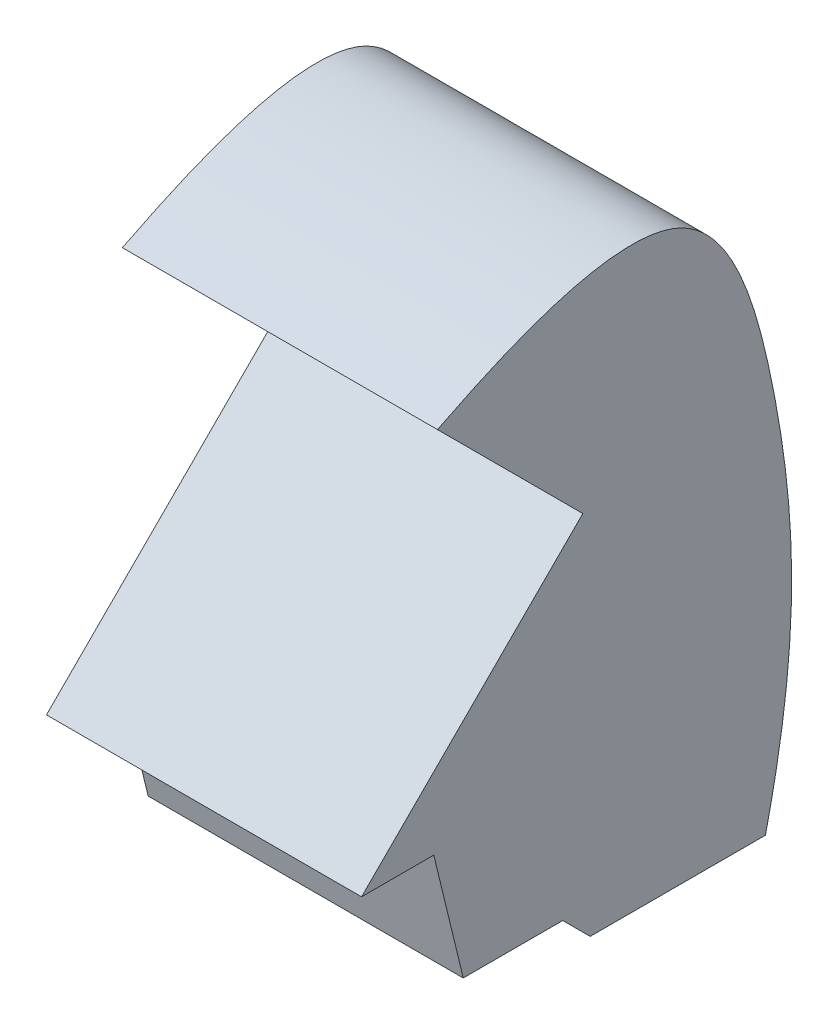
ISO-10303-21;
HEADER;
FILE_DESCRIPTION(('STEP AP214'),'2;1');
FILE_NAME('part.step','',(''),(''),'','','');
FILE_SCHEMA(('AUTOMOTIVE_DESIGN { 1 0 10303 214 1 1 1 1 }'));
ENDSEC;
DATA;
#1=APPLICATION_CONTEXT('core data for automotive mechanical design processes');
#2=APPLICATION_PROTOCOL_DEFINITION('international standard','automotive_design',2000,#1);
#3=PRODUCT_CONTEXT('',#1,'mechanical');
#4=PRODUCT('Part','Part','',(#3));
#5=PRODUCT_RELATED_PRODUCT_CATEGORY('part','',(#4));
#6=PRODUCT_DEFINITION_FORMATION('','',#4);
#7=PRODUCT_DEFINITION_CONTEXT('part definition',#1,'design');
#8=PRODUCT_DEFINITION('design','',#6,#7);
#9=PRODUCT_DEFINITION_SHAPE('','',#8);
#10=(LENGTH_UNIT() NAMED_UNIT(*) SI_UNIT(.MILLI.,.METRE.));
#11=(NAMED_UNIT(*) PLANE_ANGLE_UNIT() SI_UNIT($,.RADIAN.));
#12=(NAMED_UNIT(*) SI_UNIT($,.STERADIAN.) SOLID_ANGLE_UNIT());
#13=UNCERTAINTY_MEASURE_WITH_UNIT(LENGTH_MEASURE(1.E-05),#10,'distance_accuracy_value','');
#14=(GEOMETRIC_REPRESENTATION_CONTEXT(3) GLOBAL_UNCERTAINTY_ASSIGNED_CONTEXT((#13)) GLOBAL_UNIT_ASSIGNED_CONTEXT((#10,
#11,#12)) REPRESENTATION_CONTEXT('',''));
#15=CARTESIAN_POINT('',(0.,0.,0.));
#16=DIRECTION('',(0.,0.,1.));
#17=DIRECTION('',(1.,0.,0.));
#18=AXIS2_PLACEMENT_3D('',#15,#16,#17);
#19=CARTESIAN_POINT('',(-240.,371.568532593606,329.847711511774));
#20=DIRECTION('',(0.,-0.707106781186554,0.707106781186541));
#21=DIRECTION('',(0.,-0.707106781186541,-0.707106781186554));
#22=AXIS2_PLACEMENT_3D('',#19,#20,#21);
#23=PLANE('',#22);
#24=DIRECTION('',(0.,-0.707106781186541,-0.707106781186554));
#25=VECTOR('',#24,1.);
#26=CARTESIAN_POINT('',(0.,371.568532593606,329.847711511774));
#27=LINE('',#26,#25);
#28=CARTESIAN_POINT('',(0.,371.568532593606,329.847711511774));
#29=VERTEX_POINT('',#28);
#30=CARTESIAN_POINT('',(0.,260.825709510995,219.10488842916));
#31=VERTEX_POINT('',#30);
#32=EDGE_CURVE('E162',#29,#31,#27,.T.);
#33=ORIENTED_EDGE('',*,*,#32,.F.);
#34=DIRECTION('',(1.,0.,0.));
#35=VECTOR('',#34,1.);
#36=CARTESIAN_POINT('',(-240.,371.568532593606,329.847711511774));
#37=LINE('',#36,#35);
#38=CARTESIAN_POINT('',(-240.,371.568532593606,329.847711511774));
#39=VERTEX_POINT('',#38);
#40=EDGE_CURVE('E70',#39,#29,#37,.T.);
#41=ORIENTED_EDGE('',*,*,#40,.F.);
#42=DIRECTION('',(0.,-0.707106781186541,-0.707106781186554));
#43=VECTOR('',#42,1.);
#44=CARTESIAN_POINT('',(-240.,371.568532593606,329.847711511774));
#45=LINE('',#44,#43);
#46=CARTESIAN_POINT('',(-240.,260.825709510995,219.10488842916));
#47=VERTEX_POINT('',#46);
#48=EDGE_CURVE('E225',#39,#47,#45,.T.);
#49=ORIENTED_EDGE('',*,*,#48,.T.);
#50=DIRECTION('',(1.,0.,0.));
#51=VECTOR('',#50,1.);
#52=CARTESIAN_POINT('',(-240.,260.825709510995,219.10488842916));
#53=LINE('',#52,#51);
#54=EDGE_CURVE('E109',#47,#31,#53,.T.);
#55=ORIENTED_EDGE('',*,*,#54,.T.);
#56=EDGE_LOOP('',(#33,#41,#49,#55));
#57=FACE_BOUND('',#56,.T.);
#58=ADVANCED_FACE('F42',(#57),#23,.T.);
#59=CARTESIAN_POINT('',(-240.,371.568532593606,329.847711511774));
#60=CARTESIAN_POINT('',(-240.,393.514529027131,285.97406079657));
#61=CARTESIAN_POINT('',(-240.,470.611046021341,126.542642418236));
#62=CARTESIAN_POINT('',(-240.,211.203281294099,51.9180186353815));
#63=CARTESIAN_POINT('',(-240.,83.9872274148738,55.6395822393396));
#64=CARTESIAN_POINT('',(-240.,-20.9110778897071,80.0216255201108));
#65=B_SPLINE_CURVE_WITH_KNOTS('',3,(#59,#60,#61,#62,#63,#64),.UNSPECIFIED.,.F.,.F.,(4,1,1,4),
(0.,0.297117955120671,0.535651130390916,1.),.UNSPECIFIED.);
#66=DIRECTION('',(1.,0.,0.));
#67=VECTOR('',#66,1.);
#68=SURFACE_OF_LINEAR_EXTRUSION('',#65,#67);
#69=CARTESIAN_POINT('',(-107.552830020397,153.954227250641,60.3388246388247));
#70=CARTESIAN_POINT('',(-107.039405009663,154.049745430526,60.3414869693893));
#71=CARTESIAN_POINT('',(-106.527129661787,154.15132036925,60.3443411947038));
#72=CARTESIAN_POINT('',(-105.504966032531,154.365684513344,60.3504260574453));
#73=CARTESIAN_POINT('',(-104.995077591406,154.47847295668,60.3536566692968));
#74=CARTESIAN_POINT('',(-103.977535633197,154.71441752506,60.3604884335589));
#75=CARTESIAN_POINT('',(-103.469882920643,154.837577105064,60.364089709539));
#76=CARTESIAN_POINT('',(-102.457028041932,155.093612441107,60.3716624328432));
#77=CARTESIAN_POINT('',(-101.951825927409,155.22648840093,60.3756338879315));
#78=CARTESIAN_POINT('',(-100.943742649153,155.50154294139,60.3839536350332));
#79=CARTESIAN_POINT('',(-100.440862517759,155.64372529973,60.3883020803119));
#80=CARTESIAN_POINT('',(-99.4377148759552,155.937024406927,60.3973841776655));
#81=CARTESIAN_POINT('',(-98.9374474167489,156.088141330174,60.4021178372599));
#82=CARTESIAN_POINT('',(-97.4405220070704,156.554609009881,60.4169176534926));
#83=CARTESIAN_POINT('',(-96.447909659452,156.883030514105,60.4275812644232));
#84=CARTESIAN_POINT('',(-94.4621246821082,157.578319429855,60.4507919173261));
#85=CARTESIAN_POINT('',(-93.4691049860793,157.945622073255,60.4633611557225));
#86=CARTESIAN_POINT('',(-91.4968498419807,158.715328614705,60.4904798581394));
#87=CARTESIAN_POINT('',(-90.5176134416792,159.117730073961,60.5050291846154));
#88=CARTESIAN_POINT('',(-88.5748488550317,159.958345087119,60.5363475360737));
#89=CARTESIAN_POINT('',(-87.6113179931145,160.396552463056,60.5531161784426));
#90=CARTESIAN_POINT('',(-85.7020770219878,161.309931591556,60.5891554903673));
#91=CARTESIAN_POINT('',(-84.7563651196915,161.785099599899,60.6084259066182));
#92=CARTESIAN_POINT('',(-82.853921968404,162.790344857213,60.6504842200551));
#93=CARTESIAN_POINT('',(-81.8978808156866,163.321727389821,60.6733682380297));
#94=CARTESIAN_POINT('',(-80.0108998666751,164.427006833516,60.7225495937375));
#95=CARTESIAN_POINT('',(-79.079956844493,165.000898245017,60.7488464902597));
#96=CARTESIAN_POINT('',(-77.2467806350707,166.192885636391,60.8052988543774));
#97=CARTESIAN_POINT('',(-76.3445492987082,166.810984457753,60.8354545701022));
#98=CARTESIAN_POINT('',(-74.5767052284447,168.090215169148,60.8999720194678));
#99=CARTESIAN_POINT('',(-73.7109603869785,168.751164924948,60.9343164361289));
#100=CARTESIAN_POINT('',(-72.0170135166216,170.119378340978,61.0078052218045));
#101=CARTESIAN_POINT('',(-71.1888113329054,170.826641810181,61.0469495710216));
#102=CARTESIAN_POINT('',(-69.5752112765319,172.287979639517,61.1305455673633));
#103=CARTESIAN_POINT('',(-68.7898052805239,173.042045057411,61.174996202129));
#104=CARTESIAN_POINT('',(-67.408980093959,174.452097783649,61.260888301465));
#105=CARTESIAN_POINT('',(-66.8054242745617,175.100188230266,61.3013478220072));
#106=CARTESIAN_POINT('',(-65.6331759345248,176.426876753695,61.3863735464058));
#107=CARTESIAN_POINT('',(-65.064480477071,177.105472252236,61.4309394035296));
#108=CARTESIAN_POINT('',(-63.9648860809383,178.492325589495,61.5244120676374));
#109=CARTESIAN_POINT('',(-63.4339856487512,179.200582254364,61.5733187029194));
#110=CARTESIAN_POINT('',(-62.4129177342934,180.645272659769,61.6756589165427));
#111=CARTESIAN_POINT('',(-61.922738172191,181.381697948735,61.7290911428016));
#112=CARTESIAN_POINT('',(-60.9854739567853,182.881221801172,61.8406530293127));
#113=CARTESIAN_POINT('',(-60.5383919303972,183.644321986695,61.8987829755075));
#114=CARTESIAN_POINT('',(-59.6895800386631,185.194959891759,62.0198372533508));
#115=CARTESIAN_POINT('',(-59.2878489292368,185.982496940185,62.0827614534023));
#116=CARTESIAN_POINT('',(-58.5306551642475,187.581243702338,62.213591899271));
#117=CARTESIAN_POINT('',(-58.1752961594193,188.392501648806,62.2815087927836));
#118=CARTESIAN_POINT('',(-57.5131225149369,190.034212774783,62.422185904677));
#119=CARTESIAN_POINT('',(-57.2063096108463,190.864666639344,62.4949462960847));
#120=CARTESIAN_POINT('',(-56.641937353681,192.541676068753,62.6452264260552));
#121=CARTESIAN_POINT('',(-56.3843761847224,193.388231038695,62.7227459890107));
#122=CARTESIAN_POINT('',(-55.9184789779022,195.094843016429,62.8824578972235));
#123=CARTESIAN_POINT('',(-55.7101706423137,195.954907333935,62.9646528400623));
#124=CARTESIAN_POINT('',(-55.3425428454373,197.685001085574,63.1334954669273));
#125=CARTESIAN_POINT('',(-55.1832244769202,198.555030741545,63.2201432502283));
#126=CARTESIAN_POINT('',(-54.9126915821788,200.302082732569,63.3976717220421));
#127=CARTESIAN_POINT('',(-54.8014760469734,201.179104920558,63.4885523217252));
#128=CARTESIAN_POINT('',(-54.6492525354567,202.703124504953,63.6495519758914));
#129=CARTESIAN_POINT('',(-54.5974343550286,203.34916432275,63.7187528070526));
#130=CARTESIAN_POINT('',(-54.5183643106347,204.642521059076,63.8591950326064));
#131=CARTESIAN_POINT('',(-54.4911132049202,205.289838016405,63.9304364899118));
#132=CARTESIAN_POINT('',(-54.4452198722445,207.232151215357,64.1470483884263));
#133=CARTESIAN_POINT('',(-54.4624077068935,208.527816441753,64.2953387554946));
#134=CARTESIAN_POINT('',(-54.5863531853748,211.113647168345,64.5987489669109));
#135=CARTESIAN_POINT('',(-54.6931028417224,212.403813148674,64.753868201064));
#136=CARTESIAN_POINT('',(-54.9898321003581,214.974047792923,65.0701464598452));
#137=CARTESIAN_POINT('',(-55.1798318753214,216.25411393293,65.2313069396914));
#138=CARTESIAN_POINT('',(-55.594479262256,218.564054221678,65.5284874321322));
#139=CARTESIAN_POINT('',(-55.8062092763748,219.596392966079,65.6636410684986));
#140=CARTESIAN_POINT('',(-56.277458388162,221.649439189993,65.9369305922951));
#141=CARTESIAN_POINT('',(-56.5369704173286,222.670148366209,66.075066035955));
#142=CARTESIAN_POINT('',(-57.3829357734275,225.714105910335,66.4935420786911));
#143=CARTESIAN_POINT('',(-58.0366976286615,227.718531421128,66.7778681348049));
#144=CARTESIAN_POINT('',(-59.1362305797394,230.682910685939,67.2103383691836));
#145=CARTESIAN_POINT('',(-59.5233670358031,231.665737224035,67.3557610864063));
#146=CARTESIAN_POINT('',(-60.3349137510671,233.61574306002,67.6481604734623));
#147=CARTESIAN_POINT('',(-60.759323995387,234.582922364156,67.7951371426752));
#148=CARTESIAN_POINT('',(-61.6431869548022,236.500822539713,68.0902879604714));
#149=CARTESIAN_POINT('',(-62.1026374935224,237.451544428822,68.2384620341729));
#150=CARTESIAN_POINT('',(-63.0546675134979,239.33604550205,68.5356959368582));
#151=CARTESIAN_POINT('',(-63.5472458898858,240.2698252499,68.6847557361505));
#152=CARTESIAN_POINT('',(-64.7453594206546,242.450388789838,69.0367976426759));
#153=CARTESIAN_POINT('',(-65.4641312241868,243.689879475861,69.2400285940952));
#154=CARTESIAN_POINT('',(-66.955969093122,246.135952841,69.6468447980543));
#155=CARTESIAN_POINT('',(-67.729046011363,247.342528874872,69.8504301134401));
#156=CARTESIAN_POINT('',(-69.3264937448829,249.721733226386,70.2572211594068));
#157=CARTESIAN_POINT('',(-70.1508774983599,250.894352871014,70.4604267808236));
#158=CARTESIAN_POINT('',(-71.8483384953944,253.204279930765,70.8656759921723));
#159=CARTESIAN_POINT('',(-72.7214234340731,254.341581720978,71.0677193928702));
#160=CARTESIAN_POINT('',(-74.5120928002209,256.576759089946,71.4693715511895));
#161=CARTESIAN_POINT('',(-75.4295729474995,257.674717433254,71.6689847556016));
#162=CARTESIAN_POINT('',(-77.3090635099463,259.832024209869,72.0653733937191));
#163=CARTESIAN_POINT('',(-78.2710659765268,260.891379475099,72.2621493257995));
#164=CARTESIAN_POINT('',(-80.238281141331,262.96937208275,72.6519531428244));
#165=CARTESIAN_POINT('',(-81.2434827870519,263.988019713005,72.8449819683332));
#166=CARTESIAN_POINT('',(-83.296261934289,265.982163750233,73.2263181641211));
#167=CARTESIAN_POINT('',(-84.3438283982034,266.957671259899,73.414626743751));
#168=CARTESIAN_POINT('',(-85.9710582799104,268.408079949813,73.6969684133279));
#169=CARTESIAN_POINT('',(-86.5354851185538,268.899753752506,73.7931132685077));
#170=CARTESIAN_POINT('',(-87.6757234238138,269.869906491366,73.9836291452381));
#171=CARTESIAN_POINT('',(-88.2515330587639,270.348387521251,74.0780004474893));
#172=CARTESIAN_POINT('',(-89.4144870133569,271.291544855738,74.2647763109356));
#173=CARTESIAN_POINT('',(-90.0016292579197,271.756223648796,74.3571812257957));
#174=CARTESIAN_POINT('',(-91.1872627936023,272.671122253981,74.5398213048729));
#175=CARTESIAN_POINT('',(-91.7857523004195,273.121344309857,74.6300568052411));
#176=CARTESIAN_POINT('',(-92.9936091047932,274.006213079537,74.8080610410923));
#177=CARTESIAN_POINT('',(-93.6029654132833,274.440874324408,74.8958320605207));
#178=CARTESIAN_POINT('',(-94.8332108779547,275.294237801363,75.068755112309));
#179=CARTESIAN_POINT('',(-95.4541011208411,275.712938518218,75.1539068958617));
#180=CARTESIAN_POINT('',(-96.7076143893625,276.53347389616,75.3213344638073));
#181=CARTESIAN_POINT('',(-97.3402411315352,276.935303078493,75.4036093125346));
#182=CARTESIAN_POINT('',(-98.6175294058667,277.72098836932,75.5650010423006));
#183=CARTESIAN_POINT('',(-99.2621985918384,278.104832462977,75.6441158072009));
#184=CARTESIAN_POINT('',(-99.9127205696471,278.478936146904,75.7214694633912));
#185=B_SPLINE_CURVE_WITH_KNOTS('',3,(#69,#70,#71,#72,#73,#74,#75,#76,#77,#78,#79,#80,#81,#82,
#83,#84,#85,#86,#87,#88,#89,#90,#91,#92,#93,#94,#95,#96,#97,#98,#99,#100,#101,#102,#103,#104,
#105,#106,#107,#108,#109,#110,#111,#112,#113,#114,#115,#116,#117,#118,#119,#120,#121,#122,#123,
#124,#125,#126,#127,#128,#129,#130,#131,#132,#133,#134,#135,#136,#137,#138,#139,#140,#141,#142,
#143,#144,#145,#146,#147,#148,#149,#150,#151,#152,#153,#154,#155,#156,#157,#158,#159,#160,#161,
#162,#163,#164,#165,#166,#167,#168,#169,#170,#171,#172,#173,#174,#175,#176,#177,#178,#179,#180,
#181,#182,#183,#184),.UNSPECIFIED.,.F.,.F.,(4,2,2,2,2,2,2,2,2,2,2,2,2,2,2,2,2,2,2,2,2,2,2,2,2,2,
2,2,2,2,2,2,2,2,2,2,2,2,2,2,2,2,2,2,2,2,2,2,2,2,2,2,2,2,2,2,2,4),(0.,1.56665620122279,
3.13320601032552,4.70027976780094,6.26738640143652,7.83513315675867,9.40291052236959,
12.5389894968236,15.7148904191517,18.8905708437665,22.0657044877113,25.2405168991415,
28.5215592279138,31.8021778108026,35.0830074496966,38.3507060857486,41.6183912446059,
44.885453972116,47.5439174954355,50.2021567476036,52.8602908984148,55.5176336777306,
58.175138327245,60.8325700575511,63.4958434771747,66.159212089543,68.822482486056,
71.487247295393,74.1520715406882,76.8168398872389,78.7717720135138,80.7267644757865,
84.6358222900266,88.5445315157702,92.4541884010076,95.6403722991175,98.8260852359676,
105.199511902571,108.397843651888,111.59617412439,114.794306108083,117.992331481706,
122.332289243357,126.67311682367,131.015043513932,135.357658212503,139.690525672198,
144.022622545015,148.353617574284,152.683491398285,154.947407963028,157.210963147418,
159.474107718834,161.736899325542,163.997519627049,166.258354011123,168.519916973966,
170.782969827068),.UNSPECIFIED.);
#186=CARTESIAN_POINT('',(-107.552830020397,153.954227250641,60.3388246388247));
#187=VERTEX_POINT('',#186);
#188=CARTESIAN_POINT('',(-99.9127205696472,278.478936146904,75.7214694633912));
#189=VERTEX_POINT('',#188);
#190=EDGE_CURVE('E188',#187,#189,#185,.T.);
#191=ORIENTED_EDGE('',*,*,#190,.T.);
#192=CARTESIAN_POINT('',(-99.9127205696471,278.478936146904,75.7214694633912));
#193=CARTESIAN_POINT('',(-100.18817087931,278.595217679932,75.7455126277908));
#194=CARTESIAN_POINT('',(-100.465123965165,278.708089483218,75.7688749000382));
#195=CARTESIAN_POINT('',(-101.021900786954,278.92682852832,75.8141914223846));
#196=CARTESIAN_POINT('',(-101.301724565239,279.032695666624,75.836145651676));
#197=CARTESIAN_POINT('',(-101.86409340735,279.237234536009,75.8785986603668));
#198=CARTESIAN_POINT('',(-102.146638409919,279.335906428631,75.8990974724414));
#199=CARTESIAN_POINT('',(-102.71428783167,279.525889028273,75.9385976178953));
#200=CARTESIAN_POINT('',(-102.999392175219,279.617199952028,75.9575989953644));
#201=CARTESIAN_POINT('',(-103.567977486811,279.791089903806,75.9938115704033));
#202=CARTESIAN_POINT('',(-103.851425122282,279.873773455313,76.011044141649));
#203=CARTESIAN_POINT('',(-104.420467433427,280.031731486371,76.0439871880113));
#204=CARTESIAN_POINT('',(-104.706062122547,280.107005919476,76.0596976535863));
#205=CARTESIAN_POINT('',(-105.279219642104,280.25006184541,76.0895728363726));
#206=CARTESIAN_POINT('',(-105.566782577305,280.317842936041,76.103737470612));
#207=CARTESIAN_POINT('',(-106.143684232976,280.445860950122,76.1305046590547));
#208=CARTESIAN_POINT('',(-106.433023139952,280.506097066498,76.1431070461452));
#209=CARTESIAN_POINT('',(-107.12564815992,280.640874264702,76.1713179940785));
#210=CARTESIAN_POINT('',(-107.529650025165,280.711915821305,76.1861995648197));
#211=CARTESIAN_POINT('',(-108.340086719992,280.839554281609,76.2129505418216));
#212=CARTESIAN_POINT('',(-108.746521940664,280.896148795918,76.224819449817));
#213=CARTESIAN_POINT('',(-109.561155092526,280.995242749114,76.2456092547603));
#214=CARTESIAN_POINT('',(-109.969352930339,281.037742925598,76.2545303059779));
#215=CARTESIAN_POINT('',(-110.786780757854,281.109358682048,76.2695668427274));
#216=CARTESIAN_POINT('',(-111.196010218749,281.138480101077,76.2756835521917));
#217=CARTESIAN_POINT('',(-112.018794629769,281.184855548659,76.2854257982116));
#218=CARTESIAN_POINT('',(-112.432355757241,281.202002052513,76.2890287631672));
#219=CARTESIAN_POINT('',(-113.259764912476,281.226255608533,76.2941254217761));
#220=CARTESIAN_POINT('',(-113.673612943713,281.233362536947,76.2956190894289));
#221=CARTESIAN_POINT('',(-114.501557366673,281.241244095804,76.2972755683527));
#222=CARTESIAN_POINT('',(-114.91565377845,281.242015533134,76.2974377085284));
#223=CARTESIAN_POINT('',(-115.536907780054,281.241958619542,76.2974257475869));
#224=CARTESIAN_POINT('',(-115.744068256493,281.241737072989,76.2973791836421));
#225=CARTESIAN_POINT('',(-116.158388966382,281.241352737237,76.2972984055847));
#226=CARTESIAN_POINT('',(-116.365549199829,281.241189947822,76.297264191427));
#227=CARTESIAN_POINT('',(-116.811430418978,281.241133911134,76.2972524139474));
#228=CARTESIAN_POINT('',(-117.050151395215,281.24128550696,76.2972842754936));
#229=CARTESIAN_POINT('',(-117.527594350947,281.241716599876,76.2973748806376));
#230=CARTESIAN_POINT('',(-117.766316330441,281.241996097605,76.29743362437));
#231=CARTESIAN_POINT('',(-118.243732698755,281.241960370751,76.2974261152352));
#232=CARTESIAN_POINT('',(-118.482427087495,281.241645216575,76.297359877166));
#233=CARTESIAN_POINT('',(-118.959809933261,281.239512749131,76.2969116872392));
#234=CARTESIAN_POINT('',(-119.198498390307,281.237695441584,76.2965297365839));
#235=CARTESIAN_POINT('',(-119.67566899083,281.231700758838,76.2952698538668));
#236=CARTESIAN_POINT('',(-119.914151155332,281.227525146098,76.2943922921956));
#237=CARTESIAN_POINT('',(-120.391041116266,281.216108029507,76.2919929836224));
#238=CARTESIAN_POINT('',(-120.629448912783,281.20886652909,76.290471237442));
#239=CARTESIAN_POINT('',(-121.10597229706,281.190777623897,76.2866703570407));
#240=CARTESIAN_POINT('',(-121.34408797418,281.179932530558,76.2843917083166));
#241=CARTESIAN_POINT('',(-121.820093461438,281.154234247917,76.2789930117551));
#242=CARTESIAN_POINT('',(-122.057983269771,281.139381026842,76.2758729572477));
#243=CARTESIAN_POINT('',(-122.771258908497,281.088334944631,76.2651520454224));
#244=CARTESIAN_POINT('',(-123.246184876342,281.04565798513,76.2561909277633));
#245=CARTESIAN_POINT('',(-124.188960695205,280.942068070777,76.2344515976924));
#246=CARTESIAN_POINT('',(-124.656832782375,280.881349300655,76.2217140343887));
#247=CARTESIAN_POINT('',(-125.590172158428,280.740772877091,76.1922451902297));
#248=CARTESIAN_POINT('',(-126.055635737339,280.660891538886,76.1755089671709));
#249=CARTESIAN_POINT('',(-126.982884529833,280.481767757348,76.1380135970437));
#250=CARTESIAN_POINT('',(-127.444667947634,280.382516400192,76.1172525978566));
#251=CARTESIAN_POINT('',(-128.363373294088,280.164802310385,76.0717603453231));
#252=CARTESIAN_POINT('',(-128.820296316315,280.046344001024,76.047030006114));
#253=CARTESIAN_POINT('',(-129.728163654939,279.790659248417,75.9937163557796));
#254=CARTESIAN_POINT('',(-130.179113197748,279.653450589606,75.9651366960449));
#255=CARTESIAN_POINT('',(-131.091108643747,279.355342112033,75.9031278486594));
#256=CARTESIAN_POINT('',(-131.551921953402,279.193760162634,75.8695596881729));
#257=CARTESIAN_POINT('',(-132.468186254262,278.8508808493,75.7984401454481));
#258=CARTESIAN_POINT('',(-132.923604451371,278.669499325611,75.760871778023));
#259=CARTESIAN_POINT('',(-133.374958688496,278.478936146904,75.7214694633912));
#260=B_SPLINE_CURVE_WITH_KNOTS('',3,(#192,#193,#194,#195,#196,#197,#198,#199,#200,#201,#202,
#203,#204,#205,#206,#207,#208,#209,#210,#211,#212,#213,#214,#215,#216,#217,#218,#219,#220,#221,
#222,#223,#224,#225,#226,#227,#228,#229,#230,#231,#232,#233,#234,#235,#236,#237,#238,#239,#240,
#241,#242,#243,#244,#245,#246,#247,#248,#249,#250,#251,#252,#253,#254,#255,#256,#257,#258,#259),
.UNSPECIFIED.,.F.,.F.,(4,2,2,2,2,2,2,2,2,2,2,2,2,2,2,2,2,2,2,2,2,2,2,2,2,2,2,2,2,2,2,2,2,4),(0.,
0.899843145146393,1.79969958482816,2.69953581568805,3.59934554227714,4.48653258462743,
5.3737251880442,6.26096538772839,7.14830041333409,8.37941938025493,9.6107418298233,
10.8419998305638,12.0727199458634,13.3143535435966,14.5560024462387,15.7982771064636,
16.4197599136532,17.0412404501181,17.7574034047319,18.4735699408226,19.1896516869616,
19.9057307058518,20.6212752761552,21.3368190449621,22.0519047289458,22.7669960816283,
24.1973770276596,25.6128884115882,27.0301584519213,28.4480822454456,29.8656799590208,
31.2819423150614,32.7499189151351,34.2243979690352),.UNSPECIFIED.);
#261=CARTESIAN_POINT('',(-133.374958688496,278.478936146904,75.7214694633913));
#262=VERTEX_POINT('',#261);
#263=EDGE_CURVE('E11',#189,#262,#260,.T.);
#264=ORIENTED_EDGE('',*,*,#263,.T.);
#265=CARTESIAN_POINT('',(-133.374958688496,278.478936146904,75.7214694633913));
#266=CARTESIAN_POINT('',(-133.795502094519,278.23710881464,75.67146704713));
#267=CARTESIAN_POINT('',(-134.213588993098,277.991196496715,75.6207254546737));
#268=CARTESIAN_POINT('',(-135.044878817426,277.491558435903,75.5178521447609));
#269=CARTESIAN_POINT('',(-135.458081887827,277.237832925234,75.4657204686256));
#270=CARTESIAN_POINT('',(-136.689420532543,276.466092280838,75.307499911561));
#271=CARTESIAN_POINT('',(-137.500335267648,275.936907509634,75.1994602264147));
#272=CARTESIAN_POINT('',(-139.10243500008,274.851505672243,74.9788768967269));
#273=CARTESIAN_POINT('',(-139.893631966522,274.295305641071,74.8663360981596));
#274=CARTESIAN_POINT('',(-141.456747587979,273.157644314975,74.6372691064398));
#275=CARTESIAN_POINT('',(-142.22867091223,272.576189233718,74.5207438950828));
#276=CARTESIAN_POINT('',(-143.753461835974,271.389551273669,74.2841697582038));
#277=CARTESIAN_POINT('',(-144.506329808467,270.784368859922,74.164120901755));
#278=CARTESIAN_POINT('',(-145.994925277714,269.55007734909,73.9206173769308));
#279=CARTESIAN_POINT('',(-146.73060386598,268.920910871726,73.7971547638207));
#280=CARTESIAN_POINT('',(-148.182912560179,267.641172716802,73.5474831077753));
#281=CARTESIAN_POINT('',(-148.89953833105,266.990596241945,73.4212734514901));
#282=CARTESIAN_POINT('',(-150.313583629615,265.669067393208,73.1664647109904));
#283=CARTESIAN_POINT('',(-151.010999193767,264.998110873586,73.0378651427094));
#284=CARTESIAN_POINT('',(-152.386365662551,263.636746214678,72.7786115174009));
#285=CARTESIAN_POINT('',(-153.06431404989,262.946335582453,72.6479571980249));
#286=CARTESIAN_POINT('',(-154.400387083905,261.546908651492,72.3849124336278));
#287=CARTESIAN_POINT('',(-155.058511398929,260.837892041852,72.2525219596142));
#288=CARTESIAN_POINT('',(-156.570937118905,259.162228581946,71.9418490319983));
#289=CARTESIAN_POINT('',(-157.417391521845,258.188586091613,71.7629992970446));
#290=CARTESIAN_POINT('',(-159.073269761436,256.210883237049,71.4033720458537));
#291=CARTESIAN_POINT('',(-159.882698219315,255.206826694956,71.2225947736855));
#292=CARTESIAN_POINT('',(-161.463335279913,253.169298560596,70.859679255551));
#293=CARTESIAN_POINT('',(-162.234544021864,252.135827075506,70.6775410145453));
#294=CARTESIAN_POINT('',(-163.737247578519,250.040276601023,70.3124408421863));
#295=CARTESIAN_POINT('',(-164.468735988566,248.978193039172,70.1294787831176));
#296=CARTESIAN_POINT('',(-165.889679577395,246.826807486182,69.7633737613659));
#297=CARTESIAN_POINT('',(-166.579148925818,245.737514847131,69.580230881068));
#298=CARTESIAN_POINT('',(-167.914018237767,243.532170387709,69.2142478449431));
#299=CARTESIAN_POINT('',(-168.559417870487,242.416118366554,69.0314076913985));
#300=CARTESIAN_POINT('',(-169.803314527903,240.158285688384,68.6666165742279));
#301=CARTESIAN_POINT('',(-170.401821023687,239.016510287056,68.4846654380424));
#302=CARTESIAN_POINT('',(-171.548780660621,236.708178017941,68.122223462224));
#303=CARTESIAN_POINT('',(-172.097244195564,235.541626358453,67.9417323264824));
#304=CARTESIAN_POINT('',(-173.35027488955,232.710968342593,67.5106372886613));
#305=CARTESIAN_POINT('',(-174.029074969223,231.03518952681,67.2609863541338));
#306=CARTESIAN_POINT('',(-175.269868289602,227.640040441671,66.7673361312785));
#307=CARTESIAN_POINT('',(-175.83186777841,225.920672509584,66.52333654126));
#308=CARTESIAN_POINT('',(-176.8245495919,222.446089385484,66.0432178966029));
#309=CARTESIAN_POINT('',(-177.255441900357,220.690936370691,65.8070867856836));
#310=CARTESIAN_POINT('',(-177.971364927472,217.149830947781,65.3443836440678));
#311=CARTESIAN_POINT('',(-178.256428409698,215.363885551122,65.117809476705));
#312=CARTESIAN_POINT('',(-178.620458332095,212.153221645444,64.7232937922583));
#313=CARTESIAN_POINT('',(-178.730332557466,210.732316824303,64.5531172436013));
#314=CARTESIAN_POINT('',(-178.813058854468,208.597220852404,64.3042184231596));
#315=CARTESIAN_POINT('',(-178.826951638297,207.884851518415,64.2223079085611));
#316=CARTESIAN_POINT('',(-178.826371841981,206.459890941197,64.060748009841));
#317=CARTESIAN_POINT('',(-178.811901786258,205.747299723363,63.9810984251264));
#318=CARTESIAN_POINT('',(-178.753657955391,204.323360811789,63.8242364967202));
#319=CARTESIAN_POINT('',(-178.709897146608,203.612012707391,63.7470230904171));
#320=CARTESIAN_POINT('',(-178.592229212588,202.191604640128,63.5951440677191));
#321=CARTESIAN_POINT('',(-178.518325287655,201.482544442408,63.5204781817647));
#322=CARTESIAN_POINT('',(-178.339611582252,200.06795118702,63.373810950898));
#323=CARTESIAN_POINT('',(-178.234798249139,199.362418544284,63.3018099133474));
#324=CARTESIAN_POINT('',(-177.99368788887,197.956535929226,63.1606132753592));
#325=CARTESIAN_POINT('',(-177.857393247221,197.256185568362,63.0914174628213));
#326=CARTESIAN_POINT('',(-177.500535954791,195.6225610957,62.9326500413153));
#327=CARTESIAN_POINT('',(-177.267110204861,194.691946679348,62.844247536598));
#328=CARTESIAN_POINT('',(-176.742154406805,192.846703926325,62.6729208301984));
#329=CARTESIAN_POINT('',(-176.45062172696,191.932076315755,62.5899968768717));
#330=CARTESIAN_POINT('',(-175.809777388868,190.122805068485,62.429786250315));
#331=CARTESIAN_POINT('',(-175.460468018506,189.228160642067,62.352499354039));
#332=CARTESIAN_POINT('',(-174.705317701647,187.463007271537,62.203668638898));
#333=CARTESIAN_POINT('',(-174.299500313525,186.592488449796,62.1321224462076));
#334=CARTESIAN_POINT('',(-173.43308306528,184.878674803634,61.9947282485252));
#335=CARTESIAN_POINT('',(-172.97248120319,184.035380975519,61.9288804519194));
#336=CARTESIAN_POINT('',(-171.999081781964,182.379148345102,61.8027987452864));
#337=CARTESIAN_POINT('',(-171.486290331896,181.566206005191,61.7425641797784));
#338=CARTESIAN_POINT('',(-170.591383628058,180.239566634881,61.6467731981661));
#339=CARTESIAN_POINT('',(-170.222912521638,179.716708152369,61.6097000554368));
#340=CARTESIAN_POINT('',(-169.465221528682,178.686028550194,61.5378907261927));
#341=CARTESIAN_POINT('',(-169.076000670952,178.178208136121,61.5031546492368));
#342=CARTESIAN_POINT('',(-168.277982788979,177.178202873478,61.4359512344975));
#343=CARTESIAN_POINT('',(-167.869189540652,176.686015039294,61.40348346206));
#344=CARTESIAN_POINT('',(-167.033058409608,175.717485400958,61.3407202995666));
#345=CARTESIAN_POINT('',(-166.605719009048,175.241144899429,61.3104250878562));
#346=CARTESIAN_POINT('',(-165.29706760335,173.835737226862,61.2226259048854));
#347=CARTESIAN_POINT('',(-164.389486124279,172.930737660962,61.1682386827145));
#348=CARTESIAN_POINT('',(-162.513496154849,171.18577771915,61.066981869403));
#349=CARTESIAN_POINT('',(-161.545078552285,170.345827128726,61.0201134081973));
#350=CARTESIAN_POINT('',(-159.787566834047,168.918290961036,60.9431969448844));
#351=CARTESIAN_POINT('',(-159.009211424297,168.317477151511,60.9117732340923));
#352=CARTESIAN_POINT('',(-157.424950021229,167.152672073431,60.8524807639273));
#353=CARTESIAN_POINT('',(-156.619035883069,166.588691836688,60.8246130672336));
#354=CARTESIAN_POINT('',(-154.982836684952,165.496594408139,60.7720834959038));
#355=CARTESIAN_POINT('',(-154.152543770037,164.968488961073,60.7474226687444));
#356=CARTESIAN_POINT('',(-152.470701259495,163.947199995588,60.7009872903379));
#357=CARTESIAN_POINT('',(-151.619151514762,163.454016722226,60.6792127593436));
#358=CARTESIAN_POINT('',(-149.895187071436,162.500200940429,60.6381955548276));
#359=CARTESIAN_POINT('',(-149.022725291252,162.039653400767,60.6189593854576));
#360=CARTESIAN_POINT('',(-147.261473346043,161.151432636349,60.5828112238812));
#361=CARTESIAN_POINT('',(-146.372687257471,160.723751338993,60.5658986601422));
#362=CARTESIAN_POINT('',(-144.580594744125,159.90013633214,60.5341468127145));
#363=CARTESIAN_POINT('',(-143.677289414003,159.504200242622,60.5193073735362));
#364=CARTESIAN_POINT('',(-141.85780623173,158.743233391373,60.4914846057317));
#365=CARTESIAN_POINT('',(-140.941629381972,158.378200238402,60.4785011334387));
#366=CARTESIAN_POINT('',(-139.438119271057,157.807688818621,60.4586898489145));
#367=CARTESIAN_POINT('',(-138.854245877132,157.593055663139,60.4513589892534));
#368=CARTESIAN_POINT('',(-137.682276764087,157.175894453143,60.437323642054));
#369=CARTESIAN_POINT('',(-137.09418170014,156.973364563915,60.4306190594922));
#370=CARTESIAN_POINT('',(-135.914023128513,156.580480163008,60.4178015417294));
#371=CARTESIAN_POINT('',(-135.32196017573,156.390123986572,60.4116885255728));
#372=CARTESIAN_POINT('',(-134.134063632867,156.021790504447,60.4000255064918));
#373=CARTESIAN_POINT('',(-133.538230486505,155.843811770557,60.3944754385763));
#374=CARTESIAN_POINT('',(-132.347156789483,155.501823393774,60.3839536900929));
#375=CARTESIAN_POINT('',(-131.751942291329,155.337723217371,60.3789781685672));
#376=CARTESIAN_POINT('',(-130.558000488612,155.022693653788,60.3695467357871));
#377=CARTESIAN_POINT('',(-129.959273018163,154.87176489401,60.3650908492814));
#378=CARTESIAN_POINT('',(-128.758312485595,154.583967255239,60.3566939416836));
#379=CARTESIAN_POINT('',(-128.156078803351,154.447100948468,60.352753014749));
#380=CARTESIAN_POINT('',(-127.250132503742,154.253322012612,60.3472330807681));
#381=CARTESIAN_POINT('',(-126.947648980183,154.19063623126,60.34545798789));
#382=CARTESIAN_POINT('',(-126.341861497954,154.0693295234,60.3420409076282));
#383=CARTESIAN_POINT('',(-126.038557523292,154.010708676721,60.3403989228584));
#384=CARTESIAN_POINT('',(-125.734849237743,153.954227250641,60.3388246388247));
#385=B_SPLINE_CURVE_WITH_KNOTS('',3,(#265,#266,#267,#268,#269,#270,#271,#272,#273,#274,#275,
#276,#277,#278,#279,#280,#281,#282,#283,#284,#285,#286,#287,#288,#289,#290,#291,#292,#293,#294,
#295,#296,#297,#298,#299,#300,#301,#302,#303,#304,#305,#306,#307,#308,#309,#310,#311,#312,#313,
#314,#315,#316,#317,#318,#319,#320,#321,#322,#323,#324,#325,#326,#327,#328,#329,#330,#331,#332,
#333,#334,#335,#336,#337,#338,#339,#340,#341,#342,#343,#344,#345,#346,#347,#348,#349,#350,#351,
#352,#353,#354,#355,#356,#357,#358,#359,#360,#361,#362,#363,#364,#365,#366,#367,#368,#369,#370,
#371,#372,#373,#374,#375,#376,#377,#378,#379,#380,#381,#382,#383,#384),.UNSPECIFIED.,.F.,.F.,(4,
2,2,2,2,2,2,2,2,2,2,2,2,2,2,2,2,2,2,2,2,2,2,2,2,2,2,2,2,2,2,2,2,2,2,2,2,2,2,2,2,2,2,2,2,2,2,2,2,
2,2,2,2,2,2,2,2,2,2,4),(0.,1.46300350811503,2.9259635756992,5.84823110446263,8.76867927384909,
11.6884129319462,14.6080893932349,17.5352534176957,20.4630778527564,23.391501913013,
26.3203029570317,29.2491529721143,33.1556663414702,37.0616907990616,40.9677010262443,
44.8743392145047,48.779652634914,52.6849953669551,56.5895472858272,60.4932863845642,
65.9647766007449,71.4359740510416,76.8983620328082,82.3595222326384,86.6611778257669,
88.8122920794382,90.963214882829,93.113186149863,95.2629292130475,97.4129194581729,
99.5627468403698,102.451326407403,105.340036830786,108.228632892136,111.116028274152,
114.003529201606,116.890692519746,118.8123856434,120.734168791075,122.655582669429,
124.577154096469,128.422039519167,132.267502219034,135.217726925989,138.168831223597,
141.120897047665,144.072983585016,147.032493280415,149.991273722803,152.949832129903,
155.908161396822,157.774393791186,159.640342565109,161.506035622178,163.371513043375,
165.223692584159,167.075960302789,168.92856622638,169.855289012853,170.782029993758),.UNSPECIFIED.);
#386=CARTESIAN_POINT('',(-125.734849237746,153.954227250641,60.338824638825));
#387=VERTEX_POINT('',#386);
#388=EDGE_CURVE('E55',#262,#387,#385,.T.);
#389=ORIENTED_EDGE('',*,*,#388,.T.);
#390=CARTESIAN_POINT('',(-125.734849237746,153.954227250641,60.3388246388249));
#391=CARTESIAN_POINT('',(-125.300015968317,153.851784159535,60.3359695275594));
#392=CARTESIAN_POINT('',(-124.863674152307,153.75564584169,60.3333162197174));
#393=CARTESIAN_POINT('',(-123.988032440913,153.576651613541,60.3284139875996));
#394=CARTESIAN_POINT('',(-123.5487310875,153.493802838715,60.3261652804854));
#395=CARTESIAN_POINT('',(-122.667623636234,153.342159407779,60.3220757541163));
#396=CARTESIAN_POINT('',(-122.225817142343,153.273367041333,60.3202350013095));
#397=CARTESIAN_POINT('',(-121.345715885496,153.151384797446,60.3169877344611));
#398=CARTESIAN_POINT('',(-120.907446930153,153.098009406312,60.3155760456171));
#399=CARTESIAN_POINT('',(-120.029388370337,153.006416195316,60.3131624627753));
#400=CARTESIAN_POINT('',(-119.589599011928,152.968196028831,60.3121605053344));
#401=CARTESIAN_POINT('',(-118.70897287809,152.90748478457,60.3105724108533));
#402=CARTESIAN_POINT('',(-118.26813621038,152.884992153934,60.309986232761));
#403=CARTESIAN_POINT('',(-117.399113500203,152.856541371685,60.3092452474068));
#404=CARTESIAN_POINT('',(-116.970942999021,152.850109299685,60.3090780753877));
#405=CARTESIAN_POINT('',(-116.114619170908,152.852507346071,60.3091404607753));
#406=CARTESIAN_POINT('',(-115.686465846585,152.861338388145,60.3093700421926));
#407=CARTESIAN_POINT('',(-114.830543553481,152.894125612803,60.3102243366811));
#408=CARTESIAN_POINT('',(-114.402774849944,152.918088709135,60.3108492303685));
#409=CARTESIAN_POINT('',(-113.548343135156,152.980763453719,60.3124900293545));
#410=CARTESIAN_POINT('',(-113.12168010268,153.019474816715,60.3135059270906));
#411=CARTESIAN_POINT('',(-111.830035796225,153.158436842773,60.3171701228071));
#412=CARTESIAN_POINT('',(-110.967403856211,153.280955594123,60.3204208003819));
#413=CARTESIAN_POINT('',(-109.252094660736,153.579137448497,60.3284712435302));
#414=CARTESIAN_POINT('',(-108.399409484791,153.754754772769,60.3332696749503));
#415=CARTESIAN_POINT('',(-107.552830020397,153.954227250641,60.3388246388247));
#416=B_SPLINE_CURVE_WITH_KNOTS('',3,(#390,#391,#392,#393,#394,#395,#396,#397,#398,#399,#400,
#401,#402,#403,#404,#405,#406,#407,#408,#409,#410,#411,#412,#413,#414,#415),.UNSPECIFIED.,.F.,
.F.,(4,2,2,2,2,2,2,2,2,2,2,2,4),(0.,1.34022481854698,2.68116684497926,4.02232712521667,
5.34660388942685,6.67067552364883,7.99461640708935,9.2790021293863,10.5634655825491,
11.8485163248588,13.1335422135101,15.7455492305891,18.3553107051521),.UNSPECIFIED.);
#417=EDGE_CURVE('E180',#387,#187,#416,.T.);
#418=ORIENTED_EDGE('',*,*,#417,.T.);
#419=EDGE_LOOP('',(#191,#264,#389,#418));
#420=FACE_BOUND('',#419,.T.);
#421=CARTESIAN_POINT('',(0.,371.568532593606,329.847711511774));
#422=CARTESIAN_POINT('',(0.,393.514529027131,285.97406079657));
#423=CARTESIAN_POINT('',(0.,470.611046021341,126.542642418236));
#424=CARTESIAN_POINT('',(0.,211.203281294099,51.9180186353815));
#425=CARTESIAN_POINT('',(0.,83.9872274148738,55.6395822393396));
#426=CARTESIAN_POINT('',(0.,-20.9110778897071,80.0216255201108));
#427=B_SPLINE_CURVE_WITH_KNOTS('',3,(#421,#422,#423,#424,#425,#426),.UNSPECIFIED.,.F.,.F.,(4,1,
1,4),(0.,0.297117955120671,0.535651130390916,1.),.UNSPECIFIED.);
#428=CARTESIAN_POINT('',(0.,-20.911077889707,80.0216255201108));
#429=VERTEX_POINT('',#428);
#430=EDGE_CURVE('E228',#29,#429,#427,.T.);
#431=ORIENTED_EDGE('',*,*,#430,.T.);
#432=DIRECTION('',(1.,0.,0.));
#433=VECTOR('',#432,1.);
#434=CARTESIAN_POINT('',(-240.,-20.911077889707,80.0216255201108));
#435=LINE('',#434,#433);
#436=CARTESIAN_POINT('',(-240.,-20.911077889707,80.0216255201108));
#437=VERTEX_POINT('',#436);
#438=EDGE_CURVE('E138',#437,#429,#435,.T.);
#439=ORIENTED_EDGE('',*,*,#438,.F.);
#440=EDGE_CURVE('E148',#39,#437,#65,.T.);
#441=ORIENTED_EDGE('',*,*,#440,.F.);
#442=ORIENTED_EDGE('',*,*,#40,.T.);
#443=EDGE_LOOP('',(#431,#439,#441,#442));
#444=FACE_BOUND('',#443,.T.);
#445=ADVANCED_FACE('F167',(#420,#444),#68,.F.);
#446=CARTESIAN_POINT('',(-240.,-20.911077889707,213.497454703912));
#447=DIRECTION('',(0.,-1.,0.));
#448=DIRECTION('',(0.,0.,-1.));
#449=AXIS2_PLACEMENT_3D('',#446,#447,#448);
#450=PLANE('',#449);
#451=DIRECTION('',(0.,0.,-1.));
#452=VECTOR('',#451,1.);
#453=CARTESIAN_POINT('',(0.,-20.911077889707,213.497454703912));
#454=LINE('',#453,#452);
#455=CARTESIAN_POINT('',(0.,-20.911077889707,213.497454703912));
#456=VERTEX_POINT('',#455);
#457=EDGE_CURVE('E133',#456,#429,#454,.T.);
#458=ORIENTED_EDGE('',*,*,#457,.F.);
#459=DIRECTION('',(1.,0.,0.));
#460=VECTOR('',#459,1.);
#461=CARTESIAN_POINT('',(-240.,-20.911077889707,213.497454703912));
#462=LINE('',#461,#460);
#463=CARTESIAN_POINT('',(-240.,-20.911077889707,213.497454703912));
#464=VERTEX_POINT('',#463);
#465=EDGE_CURVE('E128',#464,#456,#462,.T.);
#466=ORIENTED_EDGE('',*,*,#465,.F.);
#467=DIRECTION('',(0.,0.,-1.));
#468=VECTOR('',#467,1.);
#469=CARTESIAN_POINT('',(-240.,-20.911077889707,213.497454703912));
#470=LINE('',#469,#468);
#471=EDGE_CURVE('E131',#464,#437,#470,.T.);
#472=ORIENTED_EDGE('',*,*,#471,.T.);
#473=ORIENTED_EDGE('',*,*,#438,.T.);
#474=EDGE_LOOP('',(#458,#466,#472,#473));
#475=FACE_BOUND('',#474,.T.);
#476=ADVANCED_FACE('F130',(#475),#450,.T.);
#477=CARTESIAN_POINT('',(-240.,0.,234.408532593619));
#478=DIRECTION('',(0.,-0.707106781186554,0.707106781186541));
#479=DIRECTION('',(0.,-0.707106781186541,-0.707106781186554));
#480=AXIS2_PLACEMENT_3D('',#477,#478,#479);
#481=PLANE('',#480);
#482=DIRECTION('',(0.,-0.707106781186541,-0.707106781186554));
#483=VECTOR('',#482,1.);
#484=CARTESIAN_POINT('',(0.,0.,234.408532593619));
#485=LINE('',#484,#483);
#486=CARTESIAN_POINT('',(0.,0.,234.408532593619));
#487=VERTEX_POINT('',#486);
#488=EDGE_CURVE('E262',#487,#456,#485,.T.);
#489=ORIENTED_EDGE('',*,*,#488,.F.);
#490=DIRECTION('',(1.,0.,0.));
#491=VECTOR('',#490,1.);
#492=CARTESIAN_POINT('',(-240.,0.,234.408532593619));
#493=LINE('',#492,#491);
#494=CARTESIAN_POINT('',(-240.,0.,234.408532593619));
#495=VERTEX_POINT('',#494);
#496=EDGE_CURVE('E139',#495,#487,#493,.T.);
#497=ORIENTED_EDGE('',*,*,#496,.F.);
#498=DIRECTION('',(0.,-0.707106781186541,-0.707106781186554));
#499=VECTOR('',#498,1.);
#500=CARTESIAN_POINT('',(-240.,0.,234.408532593619));
#501=LINE('',#500,#499);
#502=EDGE_CURVE('E146',#495,#464,#501,.T.);
#503=ORIENTED_EDGE('',*,*,#502,.T.);
#504=ORIENTED_EDGE('',*,*,#465,.T.);
#505=EDGE_LOOP('',(#489,#497,#503,#504));
#506=FACE_BOUND('',#505,.T.);
#507=ADVANCED_FACE('F151',(#506),#481,.T.);
#508=CARTESIAN_POINT('',(-240.,0.,310.198468793342));
#509=DIRECTION('',(0.,-1.,0.));
#510=DIRECTION('',(0.,0.,-1.));
#511=AXIS2_PLACEMENT_3D('',#508,#509,#510);
#512=PLANE('',#511);
#513=DIRECTION('',(0.,0.,-1.));
#514=VECTOR('',#513,1.);
#515=CARTESIAN_POINT('',(0.,0.,310.198468793342));
#516=LINE('',#515,#514);
#517=CARTESIAN_POINT('',(0.,0.,310.198468793342));
#518=VERTEX_POINT('',#517);
#519=EDGE_CURVE('E264',#518,#487,#516,.T.);
#520=ORIENTED_EDGE('',*,*,#519,.F.);
#521=DIRECTION('',(1.,0.,0.));
#522=VECTOR('',#521,1.);
#523=CARTESIAN_POINT('',(-240.,0.,310.198468793342));
#524=LINE('',#523,#522);
#525=CARTESIAN_POINT('',(-240.,0.,310.198468793342));
#526=VERTEX_POINT('',#525);
#527=EDGE_CURVE('E237',#526,#518,#524,.T.);
#528=ORIENTED_EDGE('',*,*,#527,.F.);
#529=DIRECTION('',(0.,0.,-1.));
#530=VECTOR('',#529,1.);
#531=CARTESIAN_POINT('',(-240.,0.,310.198468793342));
#532=LINE('',#531,#530);
#533=EDGE_CURVE('E152',#526,#495,#532,.T.);
#534=ORIENTED_EDGE('',*,*,#533,.T.);
#535=ORIENTED_EDGE('',*,*,#496,.T.);
#536=EDGE_LOOP('',(#520,#528,#534,#535));
#537=FACE_BOUND('',#536,.T.);
#538=ADVANCED_FACE('F298',(#537),#512,.T.);
#539=CARTESIAN_POINT('',(-240.,92.2815905669487,332.641738143175));
#540=DIRECTION('',(0.,-0.23631575032825,0.971676317580498));
#541=DIRECTION('',(0.,-0.971676317580498,-0.23631575032825));
#542=AXIS2_PLACEMENT_3D('',#539,#540,#541);
#543=PLANE('',#542);
#544=DIRECTION('',(0.,-0.971676317580498,-0.23631575032825));
#545=VECTOR('',#544,1.);
#546=CARTESIAN_POINT('',(0.,92.2815905669487,332.641738143175));
#547=LINE('',#546,#545);
#548=CARTESIAN_POINT('',(0.,92.2815905669487,332.641738143175));
#549=VERTEX_POINT('',#548);
#550=EDGE_CURVE('E267',#549,#518,#547,.T.);
#551=ORIENTED_EDGE('',*,*,#550,.F.);
#552=DIRECTION('',(1.,0.,0.));
#553=VECTOR('',#552,1.);
#554=CARTESIAN_POINT('',(-240.,92.2815905669487,332.641738143175));
#555=LINE('',#554,#553);
#556=CARTESIAN_POINT('',(-240.,92.2815905669487,332.641738143175));
#557=VERTEX_POINT('',#556);
#558=EDGE_CURVE('E239',#557,#549,#555,.T.);
#559=ORIENTED_EDGE('',*,*,#558,.F.);
#560=DIRECTION('',(0.,-0.971676317580498,-0.23631575032825));
#561=VECTOR('',#560,1.);
#562=CARTESIAN_POINT('',(-240.,92.2815905669487,332.641738143175));
#563=LINE('',#562,#561);
#564=EDGE_CURVE('E154',#557,#526,#563,.T.);
#565=ORIENTED_EDGE('',*,*,#564,.T.);
#566=ORIENTED_EDGE('',*,*,#527,.T.);
#567=EDGE_LOOP('',(#551,#559,#565,#566));
#568=FACE_BOUND('',#567,.T.);
#569=ADVANCED_FACE('F236',(#568),#543,.T.);
#570=CARTESIAN_POINT('',(-240.,92.2815905669487,387.649007373204));
#571=DIRECTION('',(0.,-1.,0.));
#572=DIRECTION('',(0.,0.,-1.));
#573=AXIS2_PLACEMENT_3D('',#570,#571,#572);
#574=PLANE('',#573);
#575=DIRECTION('',(0.,0.,-1.));
#576=VECTOR('',#575,1.);
#577=CARTESIAN_POINT('',(0.,92.2815905669487,387.649007373204));
#578=LINE('',#577,#576);
#579=CARTESIAN_POINT('',(0.,92.2815905669487,387.649007373204));
#580=VERTEX_POINT('',#579);
#581=EDGE_CURVE('E246',#580,#549,#578,.T.);
#582=ORIENTED_EDGE('',*,*,#581,.F.);
#583=DIRECTION('',(1.,0.,0.));
#584=VECTOR('',#583,1.);
#585=CARTESIAN_POINT('',(-240.,92.2815905669487,387.649007373204));
#586=LINE('',#585,#584);
#587=CARTESIAN_POINT('',(-240.,92.2815905669487,387.649007373204));
#588=VERTEX_POINT('',#587);
#589=EDGE_CURVE('E244',#588,#580,#586,.T.);
#590=ORIENTED_EDGE('',*,*,#589,.F.);
#591=DIRECTION('',(0.,0.,-1.));
#592=VECTOR('',#591,1.);
#593=CARTESIAN_POINT('',(-240.,92.2815905669487,387.649007373204));
#594=LINE('',#593,#592);
#595=EDGE_CURVE('E230',#588,#557,#594,.T.);
#596=ORIENTED_EDGE('',*,*,#595,.T.);
#597=ORIENTED_EDGE('',*,*,#558,.T.);
#598=EDGE_LOOP('',(#582,#590,#596,#597));
#599=FACE_BOUND('',#598,.T.);
#600=ADVANCED_FACE('F243',(#599),#574,.T.);
#601=CARTESIAN_POINT('',(-240.,260.825709510995,219.10488842916));
#602=DIRECTION('',(0.,0.707106781186541,0.707106781186554));
#603=DIRECTION('',(0.,-0.707106781186554,0.707106781186541));
#604=AXIS2_PLACEMENT_3D('',#601,#602,#603);
#605=PLANE('',#604);
#606=DIRECTION('',(0.,-0.707106781186554,0.707106781186541));
#607=VECTOR('',#606,1.);
#608=CARTESIAN_POINT('',(0.,260.825709510995,219.10488842916));
#609=LINE('',#608,#607);
#610=EDGE_CURVE('E270',#31,#580,#609,.T.);
#611=ORIENTED_EDGE('',*,*,#610,.F.);
#612=ORIENTED_EDGE('',*,*,#54,.F.);
#613=DIRECTION('',(0.,-0.707106781186554,0.707106781186541));
#614=VECTOR('',#613,1.);
#615=CARTESIAN_POINT('',(-240.,260.825709510995,219.10488842916));
#616=LINE('',#615,#614);
#617=EDGE_CURVE('E227',#47,#588,#616,.T.);
#618=ORIENTED_EDGE('',*,*,#617,.T.);
#619=ORIENTED_EDGE('',*,*,#589,.T.);
#620=EDGE_LOOP('',(#611,#612,#618,#619));
#621=FACE_BOUND('',#620,.T.);
#622=ADVANCED_FACE('F273',(#621),#605,.T.);
#623=CARTESIAN_POINT('',(-240.,301.288860604751,80.8105042586427));
#624=DIRECTION('',(1.,0.,0.));
#625=DIRECTION('',(0.,0.,-1.));
#626=AXIS2_PLACEMENT_3D('',#623,#624,#625);
#627=PLANE('',#626);
#628=ORIENTED_EDGE('',*,*,#48,.F.);
#629=ORIENTED_EDGE('',*,*,#440,.T.);
#630=ORIENTED_EDGE('',*,*,#471,.F.);
#631=ORIENTED_EDGE('',*,*,#502,.F.);
#632=ORIENTED_EDGE('',*,*,#533,.F.);
#633=ORIENTED_EDGE('',*,*,#564,.F.);
#634=ORIENTED_EDGE('',*,*,#595,.F.);
#635=ORIENTED_EDGE('',*,*,#617,.F.);
#636=EDGE_LOOP('',(#628,#629,#630,#631,#632,#633,#634,#635));
#637=FACE_BOUND('',#636,.T.);
#638=ADVANCED_FACE('F144',(#637),#627,.F.);
#639=CARTESIAN_POINT('',(0.,301.288860604751,80.8105042586427));
#640=DIRECTION('',(1.,0.,0.));
#641=DIRECTION('',(0.,0.,-1.));
#642=AXIS2_PLACEMENT_3D('',#639,#640,#641);
#643=PLANE('',#642);
#644=ORIENTED_EDGE('',*,*,#32,.T.);
#645=ORIENTED_EDGE('',*,*,#610,.T.);
#646=ORIENTED_EDGE('',*,*,#581,.T.);
#647=ORIENTED_EDGE('',*,*,#550,.T.);
#648=ORIENTED_EDGE('',*,*,#519,.T.);
#649=ORIENTED_EDGE('',*,*,#488,.T.);
#650=ORIENTED_EDGE('',*,*,#457,.T.);
#651=ORIENTED_EDGE('',*,*,#430,.F.);
#652=EDGE_LOOP('',(#644,#645,#646,#647,#648,#649,#650,#651));
#653=FACE_BOUND('',#652,.T.);
#654=ADVANCED_FACE('F173',(#653),#643,.T.);
#655=CARTESIAN_POINT('',(-99.5203403693523,277.617634710853,79.2629439802031));
#656=CARTESIAN_POINT('',(-107.75072134439,281.155230907651,80.1233021925823));
#657=CARTESIAN_POINT('',(-116.643839629071,280.127115466554,79.8732602110179));
#658=B_SPLINE_CURVE_WITH_KNOTS('',2,(#655,#656,#657),.UNSPECIFIED.,.F.,.F.,(3,3),(0.,1.),.UNSPECIFIED.);
#659=CARTESIAN_POINT('',(-116.643839629071,214.556332431332,63.9261711318444));
#660=DIRECTION('',(0.,-0.971676317580498,-0.23631575032825));
#661=AXIS1_PLACEMENT('',#659,#660);
#662=SURFACE_OF_REVOLUTION('',#658,#661);
#663=ORIENTED_EDGE('',*,*,#263,.F.);
#664=CARTESIAN_POINT('',(-116.643839629071,277.617634710853,79.262943980203));
#665=DIRECTION('',(0.,-0.971676317580498,-0.23631575032825));
#666=DIRECTION('',(0.,0.23631575032825,-0.971676317580498));
#667=AXIS2_PLACEMENT_3D('',#664,#665,#666);
#668=CIRCLE('',#667,17.1234992597191);
#669=EDGE_CURVE('E222',#262,#189,#668,.T.);
#670=ORIENTED_EDGE('',*,*,#669,.F.);
#671=EDGE_LOOP('',(#663,#670));
#672=FACE_BOUND('',#671,.T.);
#673=ADVANCED_FACE('F204',(#672),#662,.F.);
#674=CARTESIAN_POINT('',(-102.499782584715,156.514824750078,49.8102333553306));
#675=CARTESIAN_POINT('',(-22.4055038643051,179.613166362485,55.4278467834998));
#676=CARTESIAN_POINT('',(-57.4268280114629,252.943254735691,73.2620314209323));
#677=CARTESIAN_POINT('',(-99.5203403693523,277.617634710853,79.2629439802031));
#678=B_SPLINE_CURVE_WITH_KNOTS('',3,(#674,#675,#676,#677),.UNSPECIFIED.,.F.,.F.,(4,4),(0.,1.),.UNSPECIFIED.);
#679=CARTESIAN_POINT('',(-116.643839629071,214.556332431332,63.9261711318444));
#680=DIRECTION('',(0.,-0.971676317580498,-0.23631575032825));
#681=AXIS1_PLACEMENT('',#679,#680);
#682=SURFACE_OF_REVOLUTION('',#678,#681);
#683=ORIENTED_EDGE('',*,*,#388,.F.);
#684=ORIENTED_EDGE('',*,*,#669,.T.);
#685=ORIENTED_EDGE('',*,*,#190,.F.);
#686=CARTESIAN_POINT('',(-116.643839629071,156.514824750078,49.8102333553306));
#687=DIRECTION('',(0.,-0.971676317580498,-0.23631575032825));
#688=DIRECTION('',(0.,0.23631575032825,-0.971676317580498));
#689=AXIS2_PLACEMENT_3D('',#686,#687,#688);
#690=CIRCLE('',#689,14.1440570443563);
#691=EDGE_CURVE('E61',#387,#187,#690,.T.);
#692=ORIENTED_EDGE('',*,*,#691,.F.);
#693=EDGE_LOOP('',(#683,#684,#685,#692));
#694=FACE_BOUND('',#693,.T.);
#695=ADVANCED_FACE('F199',(#694),#682,.F.);
#696=CARTESIAN_POINT('',(-116.643839629071,153.110579168725,48.9823065711704));
#697=CARTESIAN_POINT('',(-109.367017328423,153.972612993404,49.1919568079844));
#698=CARTESIAN_POINT('',(-102.499782584715,156.514824750078,49.8102333553306));
#699=B_SPLINE_CURVE_WITH_KNOTS('',2,(#696,#697,#698),.UNSPECIFIED.,.F.,.F.,(3,3),(0.,1.),.UNSPECIFIED.);
#700=CARTESIAN_POINT('',(-116.643839629071,214.556332431332,63.9261711318444));
#701=DIRECTION('',(0.,-0.971676317580498,-0.23631575032825));
#702=AXIS1_PLACEMENT('',#700,#701);
#703=SURFACE_OF_REVOLUTION('',#699,#702);
#704=CARTESIAN_POINT('',(-116.643839629071,153.110579168725,48.9823065711704));
#705=VERTEX_POINT('',#704);
#706=VERTEX_LOOP('',#705);
#707=FACE_BOUND('',#706,.T.);
#708=ORIENTED_EDGE('',*,*,#417,.F.);
#709=ORIENTED_EDGE('',*,*,#691,.T.);
#710=EDGE_LOOP('',(#708,#709));
#711=FACE_BOUND('',#710,.T.);
#712=ADVANCED_FACE('F203',(#707,#711),#703,.F.);
#713=CLOSED_SHELL('',(#58,#445,#476,#507,#538,#569,#600,#622,#638,#654,#673,#695,#712));
#714=MANIFOLD_SOLID_BREP('B2',#713);
#715=ADVANCED_BREP_SHAPE_REPRESENTATION('',(#18,#714),#14);
#716=SHAPE_DEFINITION_REPRESENTATION(#9,#715);
ENDSEC;
END-ISO-10303-21;
